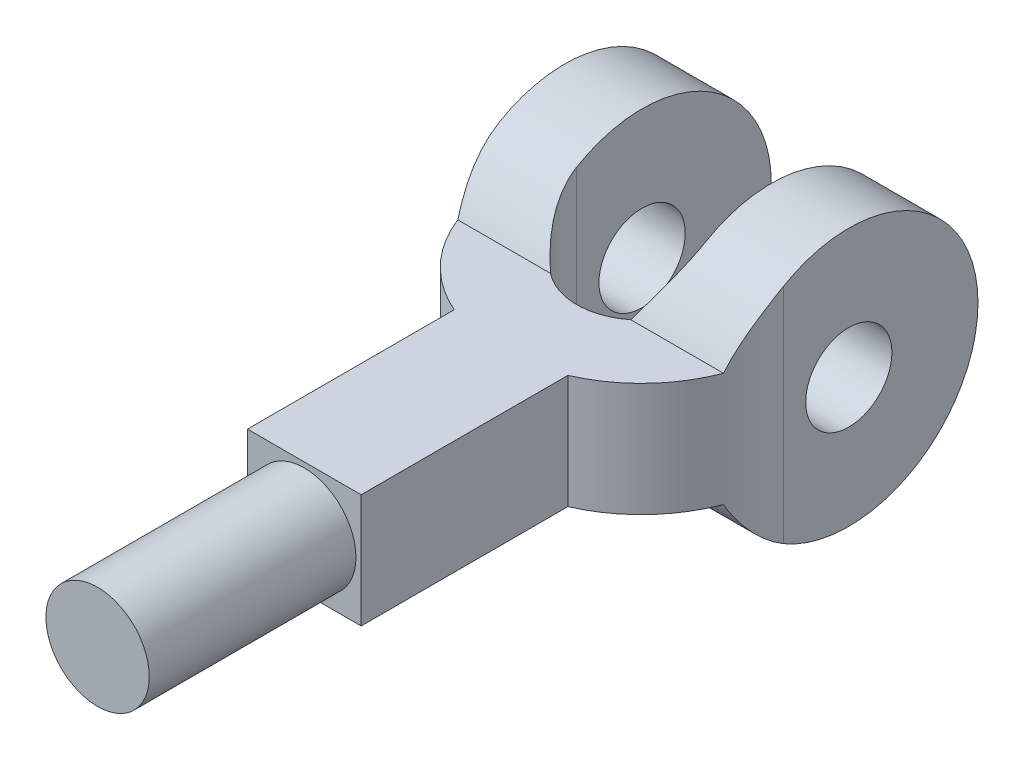
ISO-10303-21;
HEADER;
FILE_DESCRIPTION(('STEP AP214'),'2;1');
FILE_NAME('part.step','',(''),(''),'','','');
FILE_SCHEMA(('AUTOMOTIVE_DESIGN { 1 0 10303 214 1 1 1 1 }'));
ENDSEC;
DATA;
#1=APPLICATION_CONTEXT('core data for automotive mechanical design processes');
#2=APPLICATION_PROTOCOL_DEFINITION('international standard','automotive_design',2000,#1);
#3=PRODUCT_CONTEXT('',#1,'mechanical');
#4=PRODUCT('Part','Part','',(#3));
#5=PRODUCT_RELATED_PRODUCT_CATEGORY('part','',(#4));
#6=PRODUCT_DEFINITION_FORMATION('','',#4);
#7=PRODUCT_DEFINITION_CONTEXT('part definition',#1,'design');
#8=PRODUCT_DEFINITION('design','',#6,#7);
#9=PRODUCT_DEFINITION_SHAPE('','',#8);
#10=(LENGTH_UNIT() NAMED_UNIT(*) SI_UNIT(.MILLI.,.METRE.));
#11=(NAMED_UNIT(*) PLANE_ANGLE_UNIT() SI_UNIT($,.RADIAN.));
#12=(NAMED_UNIT(*) SI_UNIT($,.STERADIAN.) SOLID_ANGLE_UNIT());
#13=UNCERTAINTY_MEASURE_WITH_UNIT(LENGTH_MEASURE(1.E-05),#10,'distance_accuracy_value','');
#14=(GEOMETRIC_REPRESENTATION_CONTEXT(3) GLOBAL_UNCERTAINTY_ASSIGNED_CONTEXT((#13)) GLOBAL_UNIT_ASSIGNED_CONTEXT((#10,
#11,#12)) REPRESENTATION_CONTEXT('',''));
#15=CARTESIAN_POINT('',(0.,0.,0.));
#16=DIRECTION('',(0.,0.,1.));
#17=DIRECTION('',(1.,0.,0.));
#18=AXIS2_PLACEMENT_3D('',#15,#16,#17);
#19=CARTESIAN_POINT('',(-27.5,50.,0.));
#20=DIRECTION('',(1.,0.,0.));
#21=DIRECTION('',(0.,0.,-1.));
#22=AXIS2_PLACEMENT_3D('',#19,#20,#21);
#23=PLANE('',#22);
#24=CARTESIAN_POINT('',(-27.5,25.,-12.66));
#25=DIRECTION('',(1.,0.,0.));
#26=DIRECTION('',(0.,0.,-1.));
#27=AXIS2_PLACEMENT_3D('',#24,#25,#26);
#28=CIRCLE('',#27,8.345);
#29=CARTESIAN_POINT('',(-27.5,25.,-21.005));
#30=VERTEX_POINT('',#29);
#31=EDGE_CURVE('E228',#30,#30,#28,.T.);
#32=ORIENTED_EDGE('',*,*,#31,.T.);
#33=EDGE_LOOP('',(#32));
#34=FACE_BOUND('',#33,.T.);
#35=CARTESIAN_POINT('',(-27.5,25.,-12.66));
#36=DIRECTION('',(1.,0.,0.));
#37=DIRECTION('',(0.,0.,-1.));
#38=AXIS2_PLACEMENT_3D('',#35,#36,#37);
#39=CIRCLE('',#38,25.);
#40=CARTESIAN_POINT('',(-27.5,3.44253261628352,0.));
#41=VERTEX_POINT('',#40);
#42=CARTESIAN_POINT('',(-27.5,46.5574673837165,0.));
#43=VERTEX_POINT('',#42);
#44=EDGE_CURVE('E149',#41,#43,#39,.T.);
#45=ORIENTED_EDGE('',*,*,#44,.F.);
#46=DIRECTION('',(0.,-1.,0.));
#47=VECTOR('',#46,1.);
#48=CARTESIAN_POINT('',(-27.5,50.,0.));
#49=LINE('',#48,#47);
#50=EDGE_CURVE('E301',#43,#41,#49,.T.);
#51=ORIENTED_EDGE('',*,*,#50,.F.);
#52=EDGE_LOOP('',(#45,#51));
#53=FACE_BOUND('',#52,.T.);
#54=ADVANCED_FACE('F45',(#34,#53),#23,.F.);
#55=CARTESIAN_POINT('',(27.5,50.,0.));
#56=DIRECTION('',(-1.,0.,0.));
#57=DIRECTION('',(0.,0.,1.));
#58=AXIS2_PLACEMENT_3D('',#55,#56,#57);
#59=PLANE('',#58);
#60=CARTESIAN_POINT('',(27.5,25.,-12.66));
#61=DIRECTION('',(1.,0.,0.));
#62=DIRECTION('',(0.,0.,-1.));
#63=AXIS2_PLACEMENT_3D('',#60,#61,#62);
#64=CIRCLE('',#63,8.345);
#65=CARTESIAN_POINT('',(27.5,25.,-21.005));
#66=VERTEX_POINT('',#65);
#67=EDGE_CURVE('E148',#66,#66,#64,.T.);
#68=ORIENTED_EDGE('',*,*,#67,.F.);
#69=EDGE_LOOP('',(#68));
#70=FACE_BOUND('',#69,.T.);
#71=CARTESIAN_POINT('',(27.5,25.,-12.66));
#72=DIRECTION('',(1.,0.,0.));
#73=DIRECTION('',(0.,0.,-1.));
#74=AXIS2_PLACEMENT_3D('',#71,#72,#73);
#75=CIRCLE('',#74,25.);
#76=CARTESIAN_POINT('',(27.5,3.44253261628352,0.));
#77=VERTEX_POINT('',#76);
#78=CARTESIAN_POINT('',(27.5,46.5574673837165,0.));
#79=VERTEX_POINT('',#78);
#80=EDGE_CURVE('E136',#77,#79,#75,.T.);
#81=ORIENTED_EDGE('',*,*,#80,.T.);
#82=DIRECTION('',(0.,-1.,0.));
#83=VECTOR('',#82,1.);
#84=CARTESIAN_POINT('',(27.5,50.,0.));
#85=LINE('',#84,#83);
#86=EDGE_CURVE('E153',#79,#77,#85,.T.);
#87=ORIENTED_EDGE('',*,*,#86,.T.);
#88=EDGE_LOOP('',(#81,#87));
#89=FACE_BOUND('',#88,.T.);
#90=ADVANCED_FACE('F158',(#70,#89),#59,.F.);
#91=CARTESIAN_POINT('',(0.,50.,0.));
#92=DIRECTION('',(0.,-1.,0.));
#93=DIRECTION('',(0.,0.,-1.));
#94=AXIS2_PLACEMENT_3D('',#91,#92,#93);
#95=CYLINDRICAL_SURFACE('',#94,27.5);
#96=CARTESIAN_POINT('',(27.5,3.44253261628353,0.));
#97=CARTESIAN_POINT('',(27.5000064100216,3.6170203767677,0.297137278036953));
#98=CARTESIAN_POINT('',(27.4951844331749,3.79765493681244,0.590635094460552));
#99=CARTESIAN_POINT('',(27.4766382856092,4.17073114445457,1.1696793687987));
#100=CARTESIAN_POINT('',(27.4629154844147,4.36317097151182,1.45522704291315));
#101=CARTESIAN_POINT('',(27.4273395567106,4.75922755687698,2.01750985360668));
#102=CARTESIAN_POINT('',(27.4054945529184,4.96283297604414,2.29425349562406));
#103=CARTESIAN_POINT('',(27.3544629075488,5.38091242152332,2.83868512956266));
#104=CARTESIAN_POINT('',(27.3252760356392,5.59538678865208,3.10637283707822));
#105=CARTESIAN_POINT('',(27.2294767809172,6.24374184018554,3.88235477105203));
#106=CARTESIAN_POINT('',(27.1536686324291,6.69231482301268,4.37737976716038));
#107=CARTESIAN_POINT('',(26.9831882286162,7.62575812850552,5.32832625227106));
#108=CARTESIAN_POINT('',(26.8885138644172,8.11063250517134,5.78424336161912));
#109=CARTESIAN_POINT('',(26.7058550464797,9.01695533612832,6.57095866508621));
#110=CARTESIAN_POINT('',(26.6200919465108,9.43264199057492,6.90894617330038));
#111=CARTESIAN_POINT('',(26.4434189636212,10.2840638329334,7.55700730068837));
#112=CARTESIAN_POINT('',(26.3525100858322,10.7197951024102,7.86708634082237));
#113=CARTESIAN_POINT('',(26.1668174059729,11.6189220027506,8.46448680342255));
#114=CARTESIAN_POINT('',(26.0719924236214,12.0826987212366,8.75122177525073));
#115=CARTESIAN_POINT('',(25.8834991143702,13.0282462139983,9.29391327576847));
#116=CARTESIAN_POINT('',(25.7898309685632,13.5100197591802,9.54986503906685));
#117=CARTESIAN_POINT('',(25.6983849725756,14.,9.78994432064365));
#118=B_SPLINE_CURVE_WITH_KNOTS('',3,(#96,#97,#98,#99,#100,#101,#102,#103,#104,#105,#106,#107,
#108,#109,#110,#111,#112,#113,#114,#115,#116,#117),.UNSPECIFIED.,.F.,.F.,(4,2,2,2,2,2,2,2,2,2,
4),(0.,1.03359858006158,2.06703816327485,3.0994470091262,4.13188824819448,6.1461388101509,
8.16061465237124,9.78724401915538,11.4135567433544,13.0727312212714,14.7321622178071),.UNSPECIFIED.);
#119=CARTESIAN_POINT('',(25.6983849725756,14.,9.78994432064364));
#120=VERTEX_POINT('',#119);
#121=EDGE_CURVE('E140',#77,#120,#118,.T.);
#122=ORIENTED_EDGE('',*,*,#121,.F.);
#123=ORIENTED_EDGE('',*,*,#86,.F.);
#124=CARTESIAN_POINT('',(25.6983849725756,36.,9.78994432064365));
#125=CARTESIAN_POINT('',(25.8140691404019,36.6199234558296,9.48619944910974));
#126=CARTESIAN_POINT('',(25.9333310876651,37.2267178396408,9.15703712413836));
#127=CARTESIAN_POINT('',(26.1723920961389,38.411222190551,8.44959832570043));
#128=CARTESIAN_POINT('',(26.2921913661819,38.9889195442673,8.07130080244504));
#129=CARTESIAN_POINT('',(26.5226342564519,40.0976080669089,7.27778102628776));
#130=CARTESIAN_POINT('',(26.6334331178442,40.6294127376688,6.86374030998817));
#131=CARTESIAN_POINT('',(26.8428136137845,41.6591388265931,5.99281582066546));
#132=CARTESIAN_POINT('',(26.9413987051833,42.1570698139185,5.53594423462477));
#133=CARTESIAN_POINT('',(27.1002470638979,43.0098101857171,4.68716911167127));
#134=CARTESIAN_POINT('',(27.1641633500701,43.3719137779392,4.30325054648064));
#135=CARTESIAN_POINT('',(27.277729577524,44.071991485273,3.51213776674862));
#136=CARTESIAN_POINT('',(27.3273830081027,44.4099714868029,3.10494927429018));
#137=CARTESIAN_POINT('',(27.4102939400617,45.0667367729785,2.26038294178966));
#138=CARTESIAN_POINT('',(27.4432027360968,45.3850013237712,1.82256349147561));
#139=CARTESIAN_POINT('',(27.4768449897739,45.8409786257744,1.15039665370457));
#140=CARTESIAN_POINT('',(27.4854392297077,45.9894608429426,0.92366647909339));
#141=CARTESIAN_POINT('',(27.4970175371816,46.2790484670254,0.465379193007346));
#142=CARTESIAN_POINT('',(27.5000011609966,46.4201532896282,0.233821701220034));
#143=CARTESIAN_POINT('',(27.5,46.5574673837165,0.));
#144=B_SPLINE_CURVE_WITH_KNOTS('',3,(#124,#125,#126,#127,#128,#129,#130,#131,#132,#133,#134,
#135,#136,#137,#138,#139,#140,#141,#142,#143),.UNSPECIFIED.,.F.,.F.,(4,2,2,2,2,2,2,2,2,4),(0.,
2.09931096358299,4.19952426834013,6.24640764169904,8.2927103578225,9.88634952860904,
11.479598495235,13.104792637547,13.9180950013107,14.73146168377),.UNSPECIFIED.);
#145=CARTESIAN_POINT('',(25.6983849725756,36.,9.78994432064364));
#146=VERTEX_POINT('',#145);
#147=EDGE_CURVE('E143',#146,#79,#144,.T.);
#148=ORIENTED_EDGE('',*,*,#147,.F.);
#149=CARTESIAN_POINT('',(0.,36.,0.));
#150=DIRECTION('',(0.,1.,0.));
#151=DIRECTION('',(0.,0.,1.));
#152=AXIS2_PLACEMENT_3D('',#149,#150,#151);
#153=CIRCLE('',#152,27.5);
#154=CARTESIAN_POINT('',(11.,36.,25.2041663222571));
#155=VERTEX_POINT('',#154);
#156=EDGE_CURVE('E280',#155,#146,#153,.T.);
#157=ORIENTED_EDGE('',*,*,#156,.F.);
#158=DIRECTION('',(0.,-1.,0.));
#159=VECTOR('',#158,1.);
#160=CARTESIAN_POINT('',(11.,50.,25.2041663222571));
#161=LINE('',#160,#159);
#162=CARTESIAN_POINT('',(11.,14.,25.2041663222571));
#163=VERTEX_POINT('',#162);
#164=EDGE_CURVE('E160',#155,#163,#161,.T.);
#165=ORIENTED_EDGE('',*,*,#164,.T.);
#166=CARTESIAN_POINT('',(0.,14.,0.));
#167=DIRECTION('',(0.,-1.,0.));
#168=DIRECTION('',(0.,0.,-1.));
#169=AXIS2_PLACEMENT_3D('',#166,#167,#168);
#170=CIRCLE('',#169,27.5);
#171=EDGE_CURVE('E70',#120,#163,#170,.T.);
#172=ORIENTED_EDGE('',*,*,#171,.F.);
#173=EDGE_LOOP('',(#122,#123,#148,#157,#165,#172));
#174=FACE_BOUND('',#173,.T.);
#175=ADVANCED_FACE('F152',(#174),#95,.T.);
#176=CARTESIAN_POINT('',(11.,50.,25.2041663222571));
#177=DIRECTION('',(-1.,0.,0.));
#178=DIRECTION('',(0.,0.,1.));
#179=AXIS2_PLACEMENT_3D('',#176,#177,#178);
#180=PLANE('',#179);
#181=DIRECTION('',(0.,0.,1.));
#182=VECTOR('',#181,1.);
#183=CARTESIAN_POINT('',(11.,14.,25.2041663222571));
#184=LINE('',#183,#182);
#185=CARTESIAN_POINT('',(11.,14.,65.2041663222571));
#186=VERTEX_POINT('',#185);
#187=EDGE_CURVE('E275',#163,#186,#184,.T.);
#188=ORIENTED_EDGE('',*,*,#187,.F.);
#189=ORIENTED_EDGE('',*,*,#164,.F.);
#190=DIRECTION('',(0.,0.,-1.));
#191=VECTOR('',#190,1.);
#192=CARTESIAN_POINT('',(11.,36.,25.2041663222571));
#193=LINE('',#192,#191);
#194=CARTESIAN_POINT('',(11.,36.,65.2041663222571));
#195=VERTEX_POINT('',#194);
#196=EDGE_CURVE('E276',#195,#155,#193,.T.);
#197=ORIENTED_EDGE('',*,*,#196,.F.);
#198=DIRECTION('',(0.,-1.,0.));
#199=VECTOR('',#198,1.);
#200=CARTESIAN_POINT('',(11.,50.,65.2041663222571));
#201=LINE('',#200,#199);
#202=EDGE_CURVE('E165',#195,#186,#201,.T.);
#203=ORIENTED_EDGE('',*,*,#202,.T.);
#204=EDGE_LOOP('',(#188,#189,#197,#203));
#205=FACE_BOUND('',#204,.T.);
#206=ADVANCED_FACE('F267',(#205),#180,.F.);
#207=CARTESIAN_POINT('',(-11.,50.,65.2041663222571));
#208=DIRECTION('',(0.,0.,-1.));
#209=DIRECTION('',(-1.,0.,0.));
#210=AXIS2_PLACEMENT_3D('',#207,#208,#209);
#211=PLANE('',#210);
#212=CARTESIAN_POINT('',(0.,25.,65.2041663222571));
#213=DIRECTION('',(0.,0.,1.));
#214=DIRECTION('',(1.,0.,0.));
#215=AXIS2_PLACEMENT_3D('',#212,#213,#214);
#216=CIRCLE('',#215,10.);
#217=CARTESIAN_POINT('',(10.,25.,65.2041663222571));
#218=VERTEX_POINT('',#217);
#219=EDGE_CURVE('E12',#218,#218,#216,.T.);
#220=ORIENTED_EDGE('',*,*,#219,.F.);
#221=EDGE_LOOP('',(#220));
#222=FACE_BOUND('',#221,.T.);
#223=DIRECTION('',(1.,0.,0.));
#224=VECTOR('',#223,1.);
#225=CARTESIAN_POINT('',(-27.5,14.,65.2041663222571));
#226=LINE('',#225,#224);
#227=CARTESIAN_POINT('',(-11.,14.,65.2041663222571));
#228=VERTEX_POINT('',#227);
#229=EDGE_CURVE('E240',#228,#186,#226,.T.);
#230=ORIENTED_EDGE('',*,*,#229,.T.);
#231=ORIENTED_EDGE('',*,*,#202,.F.);
#232=DIRECTION('',(1.,0.,0.));
#233=VECTOR('',#232,1.);
#234=CARTESIAN_POINT('',(-27.5,36.,65.2041663222571));
#235=LINE('',#234,#233);
#236=CARTESIAN_POINT('',(-11.,36.,65.2041663222571));
#237=VERTEX_POINT('',#236);
#238=EDGE_CURVE('E244',#237,#195,#235,.T.);
#239=ORIENTED_EDGE('',*,*,#238,.F.);
#240=DIRECTION('',(0.,-1.,0.));
#241=VECTOR('',#240,1.);
#242=CARTESIAN_POINT('',(-11.,50.,65.2041663222571));
#243=LINE('',#242,#241);
#244=EDGE_CURVE('E175',#237,#228,#243,.T.);
#245=ORIENTED_EDGE('',*,*,#244,.T.);
#246=EDGE_LOOP('',(#230,#231,#239,#245));
#247=FACE_BOUND('',#246,.T.);
#248=ADVANCED_FACE('F263',(#222,#247),#211,.F.);
#249=CARTESIAN_POINT('',(-11.,50.,25.2041663222571));
#250=DIRECTION('',(1.,0.,0.));
#251=DIRECTION('',(0.,0.,-1.));
#252=AXIS2_PLACEMENT_3D('',#249,#250,#251);
#253=PLANE('',#252);
#254=DIRECTION('',(0.,0.,-1.));
#255=VECTOR('',#254,1.);
#256=CARTESIAN_POINT('',(-11.,14.,25.2041663222571));
#257=LINE('',#256,#255);
#258=CARTESIAN_POINT('',(-11.,14.,25.2041663222571));
#259=VERTEX_POINT('',#258);
#260=EDGE_CURVE('E63',#228,#259,#257,.T.);
#261=ORIENTED_EDGE('',*,*,#260,.F.);
#262=ORIENTED_EDGE('',*,*,#244,.F.);
#263=DIRECTION('',(0.,0.,1.));
#264=VECTOR('',#263,1.);
#265=CARTESIAN_POINT('',(-11.,36.,25.2041663222571));
#266=LINE('',#265,#264);
#267=CARTESIAN_POINT('',(-11.,36.,25.2041663222571));
#268=VERTEX_POINT('',#267);
#269=EDGE_CURVE('E279',#268,#237,#266,.T.);
#270=ORIENTED_EDGE('',*,*,#269,.F.);
#271=DIRECTION('',(0.,-1.,0.));
#272=VECTOR('',#271,1.);
#273=CARTESIAN_POINT('',(-11.,50.,25.2041663222571));
#274=LINE('',#273,#272);
#275=EDGE_CURVE('E179',#268,#259,#274,.T.);
#276=ORIENTED_EDGE('',*,*,#275,.T.);
#277=EDGE_LOOP('',(#261,#262,#270,#276));
#278=FACE_BOUND('',#277,.T.);
#279=ADVANCED_FACE('F266',(#278),#253,.F.);
#280=CARTESIAN_POINT('',(0.,50.,0.));
#281=DIRECTION('',(0.,-1.,0.));
#282=DIRECTION('',(0.,0.,-1.));
#283=AXIS2_PLACEMENT_3D('',#280,#281,#282);
#284=CYLINDRICAL_SURFACE('',#283,27.5);
#285=CARTESIAN_POINT('',(-25.6983849725756,14.,9.78994432064364));
#286=CARTESIAN_POINT('',(-25.8140691404019,13.3800765441704,9.48619944910974));
#287=CARTESIAN_POINT('',(-25.9333310876651,12.7732821603592,9.15703712413836));
#288=CARTESIAN_POINT('',(-26.1723920961389,11.588777809449,8.44959832570043));
#289=CARTESIAN_POINT('',(-26.2921913661819,11.0110804557327,8.07130080244503));
#290=CARTESIAN_POINT('',(-26.5226342564518,9.90239193309109,7.27778102628776));
#291=CARTESIAN_POINT('',(-26.6334331178442,9.37058726233118,6.86374030998817));
#292=CARTESIAN_POINT('',(-26.8428136137845,8.34086117340695,5.99281582066546));
#293=CARTESIAN_POINT('',(-26.9413987051833,7.84293018608148,5.53594423462477));
#294=CARTESIAN_POINT('',(-27.1002470638979,6.99018981428286,4.68716911167127));
#295=CARTESIAN_POINT('',(-27.1641633500701,6.62808622206083,4.30325054648064));
#296=CARTESIAN_POINT('',(-27.277729577524,5.92800851472697,3.51213776674862));
#297=CARTESIAN_POINT('',(-27.3273830081027,5.59002851319714,3.10494927429017));
#298=CARTESIAN_POINT('',(-27.4102939400617,4.93326322702154,2.26038294178966));
#299=CARTESIAN_POINT('',(-27.4432027360968,4.61499867622882,1.82256349147561));
#300=CARTESIAN_POINT('',(-27.4768449897739,4.15902137422562,1.15039665370457));
#301=CARTESIAN_POINT('',(-27.4854392297077,4.0105391570574,0.92366647909339));
#302=CARTESIAN_POINT('',(-27.4970175371816,3.72095153297464,0.465379193007346));
#303=CARTESIAN_POINT('',(-27.5000011609966,3.57984671037178,0.233821701220034));
#304=CARTESIAN_POINT('',(-27.5,3.44253261628353,0.));
#305=B_SPLINE_CURVE_WITH_KNOTS('',3,(#285,#286,#287,#288,#289,#290,#291,#292,#293,#294,#295,
#296,#297,#298,#299,#300,#301,#302,#303,#304),.UNSPECIFIED.,.F.,.F.,(4,2,2,2,2,2,2,2,2,4),(0.,
2.09931096358299,4.19952426834013,6.24640764169904,8.29271035782249,9.88634952860903,
11.479598495235,13.104792637547,13.9180950013107,14.73146168377),.UNSPECIFIED.);
#306=CARTESIAN_POINT('',(-25.6983849725756,14.,9.78994432064364));
#307=VERTEX_POINT('',#306);
#308=EDGE_CURVE('E156',#307,#41,#305,.T.);
#309=ORIENTED_EDGE('',*,*,#308,.F.);
#310=CARTESIAN_POINT('',(0.,14.,0.));
#311=DIRECTION('',(0.,-1.,0.));
#312=DIRECTION('',(0.,0.,-1.));
#313=AXIS2_PLACEMENT_3D('',#310,#311,#312);
#314=CIRCLE('',#313,27.5);
#315=EDGE_CURVE('E298',#259,#307,#314,.T.);
#316=ORIENTED_EDGE('',*,*,#315,.F.);
#317=ORIENTED_EDGE('',*,*,#275,.F.);
#318=CARTESIAN_POINT('',(0.,36.,0.));
#319=DIRECTION('',(0.,1.,0.));
#320=DIRECTION('',(0.,0.,1.));
#321=AXIS2_PLACEMENT_3D('',#318,#319,#320);
#322=CIRCLE('',#321,27.5);
#323=CARTESIAN_POINT('',(-25.6983849725756,36.,9.78994432064364));
#324=VERTEX_POINT('',#323);
#325=EDGE_CURVE('E284',#324,#268,#322,.T.);
#326=ORIENTED_EDGE('',*,*,#325,.F.);
#327=CARTESIAN_POINT('',(-27.5,46.5574673837165,0.));
#328=CARTESIAN_POINT('',(-27.5000064100216,46.3829796232323,0.297137278036951));
#329=CARTESIAN_POINT('',(-27.4951844331749,46.2023450631876,0.59063509446055));
#330=CARTESIAN_POINT('',(-27.4766382856092,45.8292688555454,1.1696793687987));
#331=CARTESIAN_POINT('',(-27.4629154844147,45.6368290284882,1.45522704291316));
#332=CARTESIAN_POINT('',(-27.4273395567106,45.240772443123,2.01750985360668));
#333=CARTESIAN_POINT('',(-27.4054945529184,45.0371670239559,2.29425349562406));
#334=CARTESIAN_POINT('',(-27.3544629075488,44.6190875784767,2.83868512956266));
#335=CARTESIAN_POINT('',(-27.3252760356392,44.4046132113479,3.10637283707822));
#336=CARTESIAN_POINT('',(-27.2294767809172,43.7562581598145,3.88235477105203));
#337=CARTESIAN_POINT('',(-27.1536686324291,43.3076851769873,4.37737976716038));
#338=CARTESIAN_POINT('',(-26.9831882286162,42.3742418714945,5.32832625227106));
#339=CARTESIAN_POINT('',(-26.8885138644172,41.8893674948287,5.78424336161912));
#340=CARTESIAN_POINT('',(-26.7058550464797,40.9830446638717,6.57095866508621));
#341=CARTESIAN_POINT('',(-26.6200919465108,40.5673580094251,6.90894617330038));
#342=CARTESIAN_POINT('',(-26.4434189636212,39.7159361670666,7.55700730068837));
#343=CARTESIAN_POINT('',(-26.3525100858322,39.2802048975898,7.86708634082238));
#344=CARTESIAN_POINT('',(-26.1668174059729,38.3810779972494,8.46448680342256));
#345=CARTESIAN_POINT('',(-26.0719924236214,37.9173012787634,8.75122177525073));
#346=CARTESIAN_POINT('',(-25.8834991143702,36.9717537860017,9.29391327576847));
#347=CARTESIAN_POINT('',(-25.7898309685632,36.4899802408197,9.54986503906685));
#348=CARTESIAN_POINT('',(-25.6983849725756,36.,9.78994432064365));
#349=B_SPLINE_CURVE_WITH_KNOTS('',3,(#327,#328,#329,#330,#331,#332,#333,#334,#335,#336,#337,
#338,#339,#340,#341,#342,#343,#344,#345,#346,#347,#348),.UNSPECIFIED.,.F.,.F.,(4,2,2,2,2,2,2,2,
2,2,4),(0.,1.03359858006158,2.06703816327485,3.0994470091262,4.13188824819448,6.1461388101509,
8.16061465237124,9.78724401915538,11.4135567433544,13.0727312212715,14.7321622178071),.UNSPECIFIED.);
#350=EDGE_CURVE('E313',#43,#324,#349,.T.);
#351=ORIENTED_EDGE('',*,*,#350,.F.);
#352=ORIENTED_EDGE('',*,*,#50,.T.);
#353=EDGE_LOOP('',(#309,#316,#317,#326,#351,#352));
#354=FACE_BOUND('',#353,.T.);
#355=ADVANCED_FACE('F47',(#354),#284,.T.);
#356=CARTESIAN_POINT('',(-27.5,25.,-12.66));
#357=DIRECTION('',(1.,0.,0.));
#358=DIRECTION('',(0.,0.,-1.));
#359=AXIS2_PLACEMENT_3D('',#356,#357,#358);
#360=CYLINDRICAL_SURFACE('',#359,8.345);
#361=ORIENTED_EDGE('',*,*,#31,.F.);
#362=EDGE_LOOP('',(#361));
#363=FACE_BOUND('',#362,.T.);
#364=CARTESIAN_POINT('',(-12.5,25.,-12.66));
#365=DIRECTION('',(-1.,0.,0.));
#366=DIRECTION('',(0.,0.,1.));
#367=AXIS2_PLACEMENT_3D('',#364,#365,#366);
#368=CIRCLE('',#367,8.345);
#369=CARTESIAN_POINT('',(-12.5,25.,-4.315));
#370=VERTEX_POINT('',#369);
#371=EDGE_CURVE('E385',#370,#370,#368,.T.);
#372=ORIENTED_EDGE('',*,*,#371,.F.);
#373=EDGE_LOOP('',(#372));
#374=FACE_BOUND('',#373,.T.);
#375=ADVANCED_FACE('F328',(#363,#374),#360,.F.);
#376=CARTESIAN_POINT('',(-27.5,14.,9.78994432064364));
#377=DIRECTION('',(0.,-1.,0.));
#378=DIRECTION('',(0.,0.,-1.));
#379=AXIS2_PLACEMENT_3D('',#376,#377,#378);
#380=PLANE('',#379);
#381=ORIENTED_EDGE('',*,*,#315,.T.);
#382=DIRECTION('',(1.,0.,0.));
#383=VECTOR('',#382,1.);
#384=CARTESIAN_POINT('',(-27.5,14.,9.78994432064364));
#385=LINE('',#384,#383);
#386=CARTESIAN_POINT('',(-7.77219339689237,14.,9.78994432064364));
#387=VERTEX_POINT('',#386);
#388=EDGE_CURVE('E195',#307,#387,#385,.T.);
#389=ORIENTED_EDGE('',*,*,#388,.T.);
#390=CARTESIAN_POINT('',(0.,14.,0.));
#391=DIRECTION('',(0.,-1.,0.));
#392=DIRECTION('',(0.,0.,-1.));
#393=AXIS2_PLACEMENT_3D('',#390,#391,#392);
#394=CIRCLE('',#393,12.5);
#395=CARTESIAN_POINT('',(7.77219339689237,14.,9.78994432064364));
#396=VERTEX_POINT('',#395);
#397=EDGE_CURVE('E50',#387,#396,#394,.F.);
#398=ORIENTED_EDGE('',*,*,#397,.T.);
#399=EDGE_CURVE('E193',#396,#120,#385,.T.);
#400=ORIENTED_EDGE('',*,*,#399,.T.);
#401=ORIENTED_EDGE('',*,*,#171,.T.);
#402=ORIENTED_EDGE('',*,*,#187,.T.);
#403=ORIENTED_EDGE('',*,*,#229,.F.);
#404=ORIENTED_EDGE('',*,*,#260,.T.);
#405=EDGE_LOOP('',(#381,#389,#398,#400,#401,#402,#403,#404));
#406=FACE_BOUND('',#405,.T.);
#407=ADVANCED_FACE('F192',(#406),#380,.T.);
#408=CARTESIAN_POINT('',(-27.5,36.,9.78994432064364));
#409=DIRECTION('',(0.,1.,0.));
#410=DIRECTION('',(0.,0.,1.));
#411=AXIS2_PLACEMENT_3D('',#408,#409,#410);
#412=PLANE('',#411);
#413=ORIENTED_EDGE('',*,*,#325,.T.);
#414=ORIENTED_EDGE('',*,*,#269,.T.);
#415=ORIENTED_EDGE('',*,*,#238,.T.);
#416=ORIENTED_EDGE('',*,*,#196,.T.);
#417=ORIENTED_EDGE('',*,*,#156,.T.);
#418=DIRECTION('',(1.,0.,0.));
#419=VECTOR('',#418,1.);
#420=CARTESIAN_POINT('',(-27.5,36.,9.78994432064364));
#421=LINE('',#420,#419);
#422=CARTESIAN_POINT('',(7.77219339689237,36.,9.78994432064364));
#423=VERTEX_POINT('',#422);
#424=EDGE_CURVE('E247',#423,#146,#421,.T.);
#425=ORIENTED_EDGE('',*,*,#424,.F.);
#426=CARTESIAN_POINT('',(0.,36.,0.));
#427=DIRECTION('',(0.,1.,0.));
#428=DIRECTION('',(0.,0.,1.));
#429=AXIS2_PLACEMENT_3D('',#426,#427,#428);
#430=CIRCLE('',#429,12.5);
#431=CARTESIAN_POINT('',(-7.77219339689237,36.,9.78994432064364));
#432=VERTEX_POINT('',#431);
#433=EDGE_CURVE('E182',#423,#432,#430,.F.);
#434=ORIENTED_EDGE('',*,*,#433,.T.);
#435=EDGE_CURVE('E238',#324,#432,#421,.T.);
#436=ORIENTED_EDGE('',*,*,#435,.F.);
#437=EDGE_LOOP('',(#413,#414,#415,#416,#417,#425,#434,#436));
#438=FACE_BOUND('',#437,.T.);
#439=ADVANCED_FACE('F317',(#438),#412,.T.);
#440=CARTESIAN_POINT('',(-27.5,25.,-12.66));
#441=DIRECTION('',(1.,0.,0.));
#442=DIRECTION('',(0.,0.,-1.));
#443=AXIS2_PLACEMENT_3D('',#440,#441,#442);
#444=CYLINDRICAL_SURFACE('',#443,25.);
#445=ORIENTED_EDGE('',*,*,#350,.T.);
#446=ORIENTED_EDGE('',*,*,#435,.T.);
#447=CARTESIAN_POINT('',(-7.77219339689236,36.,9.78994432064365));
#448=CARTESIAN_POINT('',(-7.95125493530936,36.2901245964074,9.64777995607245));
#449=CARTESIAN_POINT('',(-8.12800668946448,36.5786238437377,9.49945589016651));
#450=CARTESIAN_POINT('',(-8.47612487202498,37.1521827718378,9.19018870541052));
#451=CARTESIAN_POINT('',(-8.64749014787699,37.437241708548,9.02924291127213));
#452=CARTESIAN_POINT('',(-9.1532241324392,38.2884399553427,8.52614290537653));
#453=CARTESIAN_POINT('',(-9.47817836811775,38.8489075391986,8.16455093610505));
#454=CARTESIAN_POINT('',(-10.0991322030903,39.9579750790307,7.38308409473828));
#455=CARTESIAN_POINT('',(-10.3947038160651,40.5063283960239,6.96251702677902));
#456=CARTESIAN_POINT('',(-10.9421723343344,41.5780074053616,6.06582581804181));
#457=CARTESIAN_POINT('',(-11.1941321799227,42.1013683625994,5.58978342878708));
#458=CARTESIAN_POINT('',(-11.5510387695185,42.9089134335481,4.78847679236379));
#459=CARTESIAN_POINT('',(-11.6739317626676,43.203263868376,4.48131431479051));
#460=CARTESIAN_POINT('',(-11.8977662852443,43.7796165789634,3.84785437948333));
#461=CARTESIAN_POINT('',(-11.9987075649322,44.0616187142099,3.52155670410611));
#462=CARTESIAN_POINT('',(-12.1751777945896,44.6102480191721,2.85208187938311));
#463=CARTESIAN_POINT('',(-12.2508128907587,44.8769354214119,2.50898233518133));
#464=CARTESIAN_POINT('',(-12.3739897966923,45.3942414194251,1.80600232646627));
#465=CARTESIAN_POINT('',(-12.4215363635321,45.6448627297396,1.44612471463281));
#466=CARTESIAN_POINT('',(-12.4800744148841,46.0893119604496,0.770461570243058));
#467=CARTESIAN_POINT('',(-12.4956970762415,46.2858114047631,0.456832692726226));
#468=CARTESIAN_POINT('',(-12.5027598606034,46.6647958990798,-0.179072395358173));
#469=CARTESIAN_POINT('',(-12.4942020889823,46.8472821677798,-0.501347850653866));
#470=CARTESIAN_POINT('',(-12.4510349714951,47.197153535467,-1.15248043547064));
#471=CARTESIAN_POINT('',(-12.4164163302729,47.3645332223978,-1.48133987260873));
#472=CARTESIAN_POINT('',(-12.3194956100155,47.6831223623089,-2.14283734231292));
#473=CARTESIAN_POINT('',(-12.2571933441718,47.8343317061636,-2.47547540036231));
#474=CARTESIAN_POINT('',(-12.1031898818013,48.120707162952,-3.14339754453979));
#475=CARTESIAN_POINT('',(-12.0113120994641,48.2557700538399,-3.47868541507488));
#476=CARTESIAN_POINT('',(-11.7975025879107,48.5083863162146,-4.14629610517807));
#477=CARTESIAN_POINT('',(-11.675570459707,48.6259394552165,-4.47861888532231));
#478=CARTESIAN_POINT('',(-11.4015256289367,48.8435456183411,-5.13635049223174));
#479=CARTESIAN_POINT('',(-11.2494231284989,48.9436045366841,-5.4617616151101));
#480=CARTESIAN_POINT('',(-10.9154597904565,49.1267895922462,-6.10188682282948));
#481=CARTESIAN_POINT('',(-10.7336016705094,49.2099172742839,-6.41660188140237));
#482=CARTESIAN_POINT('',(-10.3622763257927,49.3521562253686,-6.99851854272957));
#483=CARTESIAN_POINT('',(-10.1757258479853,49.4128882419295,-7.26719213596747));
#484=CARTESIAN_POINT('',(-9.78084745450852,49.5226385241789,-7.79053617959688));
#485=CARTESIAN_POINT('',(-9.57252132073323,49.5716577472441,-8.04520777316853));
#486=CARTESIAN_POINT('',(-9.1354345708889,49.6591610810036,-8.5382896371195));
#487=CARTESIAN_POINT('',(-8.90667403707088,49.6976452341003,-8.77669997294559));
#488=CARTESIAN_POINT('',(-8.43026263450028,49.7653967310706,-9.23525791192028));
#489=CARTESIAN_POINT('',(-8.1826112517426,49.794663824044,-9.45540501780032));
#490=CARTESIAN_POINT('',(-7.6707337024581,49.8453088682533,-9.87517837614762));
#491=CARTESIAN_POINT('',(-7.40654821205247,49.8667053536096,-10.0748520296214));
#492=CARTESIAN_POINT('',(-6.86287230355462,49.9030967378969,-10.4527790599293));
#493=CARTESIAN_POINT('',(-6.58338205179693,49.918091706385,-10.6310326694925));
#494=CARTESIAN_POINT('',(-6.01092519448945,49.9430271165508,-10.9648795591732));
#495=CARTESIAN_POINT('',(-5.71795694699316,49.9529669406018,-11.1204700687056));
#496=CARTESIAN_POINT('',(-5.12049411895543,49.9690409001247,-11.407911552963));
#497=CARTESIAN_POINT('',(-4.81599919172051,49.9751749210309,-11.5397618129535));
#498=CARTESIAN_POINT('',(-4.18477125172921,49.9849498791525,-11.7837524042981));
#499=CARTESIAN_POINT('',(-3.85763827540777,49.9884783524719,-11.8948636384536));
#500=CARTESIAN_POINT('',(-3.19528304436041,49.9936828965981,-12.089637625019));
#501=CARTESIAN_POINT('',(-2.86006059300071,49.9953589223304,-12.1732997094898));
#502=CARTESIAN_POINT('',(-2.18381300930325,49.9976833792043,-12.3126011129079));
#503=CARTESIAN_POINT('',(-1.8427874514936,49.9983317346682,-12.368238367901));
#504=CARTESIAN_POINT('',(-1.15730172764831,49.9991615632358,-12.4510981445285));
#505=CARTESIAN_POINT('',(-0.812841548578814,49.999343034567,-12.4783205582915));
#506=CARTESIAN_POINT('',(-0.117048592551513,49.9995192477441,-12.5043802127893));
#507=CARTESIAN_POINT('',(0.234302430120665,49.9995108015831,-12.5027329399446));
#508=CARTESIAN_POINT('',(0.935622976444318,49.9992823891482,-12.4698775472103));
#509=CARTESIAN_POINT('',(1.2855924803338,49.9990624198594,-12.4386690059881));
#510=CARTESIAN_POINT('',(1.98168972507581,49.9980814277038,-12.346908796249));
#511=CARTESIAN_POINT('',(2.32781717832854,49.9973203646067,-12.2863549460163));
#512=CARTESIAN_POINT('',(3.01374371723942,49.9946273127458,-12.1363338330461));
#513=CARTESIAN_POINT('',(3.35354281464168,49.9926953261551,-12.0468666239715));
#514=CARTESIAN_POINT('',(4.02471048101889,49.9867491231399,-11.8395600324694));
#515=CARTESIAN_POINT('',(4.35607073788998,49.9827329311577,-11.7216937883047));
#516=CARTESIAN_POINT('',(5.00764314657957,49.9714578961648,-11.4584887452686));
#517=CARTESIAN_POINT('',(5.32785524796061,49.9641990384854,-11.313149822122));
#518=CARTESIAN_POINT('',(5.95480077246909,49.9450711881034,-10.9960786074901));
#519=CARTESIAN_POINT('',(6.26153406143898,49.9332021495261,-10.8243460533797));
#520=CARTESIAN_POINT('',(6.85924353785896,49.9033275253775,-10.4558136074393));
#521=CARTESIAN_POINT('',(7.1502199258004,49.8853220179081,-10.2590140346699));
#522=CARTESIAN_POINT('',(7.71139025068222,49.8417673894409,-9.84403437598554));
#523=CARTESIAN_POINT('',(7.98176341852745,49.8162957715652,-9.62608862874164));
#524=CARTESIAN_POINT('',(8.50288846313148,49.7561344954557,-9.16902383010334));
#525=CARTESIAN_POINT('',(8.75364045684763,49.7214448921736,-8.92990490493554));
#526=CARTESIAN_POINT('',(9.23354932915287,49.6412971385836,-8.43272748827872));
#527=CARTESIAN_POINT('',(9.46271426451288,49.5958430282653,-8.17467612727374));
#528=CARTESIAN_POINT('',(9.89787497151594,49.4927202028717,-7.6420107709033));
#529=CARTESIAN_POINT('',(10.1038716471067,49.4350519646038,-7.36739742237365));
#530=CARTESIAN_POINT('',(10.4837954491191,49.3087683007707,-6.8152729220263));
#531=CARTESIAN_POINT('',(10.6586562338171,49.2406639394106,-6.538286829965));
#532=CARTESIAN_POINT('',(10.9847695321018,49.0911826630333,-5.97419178603637));
#533=CARTESIAN_POINT('',(11.1360227901579,49.0098061667219,-5.68708315373619));
#534=CARTESIAN_POINT('',(11.4143409007668,48.833227154032,-5.10555773751999));
#535=CARTESIAN_POINT('',(11.5414096313598,48.7380268586525,-4.81114213386557));
#536=CARTESIAN_POINT('',(11.7712248944291,48.5335304058665,-4.21775987401757));
#537=CARTESIAN_POINT('',(11.8739713820671,48.4242342224745,-3.9187932094351));
#538=CARTESIAN_POINT('',(12.0538573610705,48.1935422399345,-3.32406801254909));
#539=CARTESIAN_POINT('',(12.1313967165444,48.0723796128859,-3.02833955340843));
#540=CARTESIAN_POINT('',(12.2637642015335,47.8167796152106,-2.43756602406794));
#541=CARTESIAN_POINT('',(12.3185927406922,47.6823424840753,-2.14252094163725));
#542=CARTESIAN_POINT('',(12.4064236243125,47.4006868834199,-1.55525754771891));
#543=CARTESIAN_POINT('',(12.4394221173885,47.2534661637239,-1.26303974399267));
#544=CARTESIAN_POINT('',(12.4846909813056,46.9469431493083,-0.683389357166898));
#545=CARTESIAN_POINT('',(12.496960256084,46.7876402162041,-0.395957027896088));
#546=CARTESIAN_POINT('',(12.5022630635316,46.4433328546751,0.197338121115261));
#547=CARTESIAN_POINT('',(12.4935232536734,46.2572988344719,0.502618493632299));
#548=CARTESIAN_POINT('',(12.4548025976939,45.8729792321145,1.10394218601792));
#549=CARTESIAN_POINT('',(12.424821041238,45.6746932404508,1.39998519663884));
#550=CARTESIAN_POINT('',(12.3454141934786,45.266926456987,1.98164849477422));
#551=CARTESIAN_POINT('',(12.295984000246,45.0574428543983,2.26726613477953));
#552=CARTESIAN_POINT('',(12.179456795494,44.6283852236451,2.82712272634654));
#553=CARTESIAN_POINT('',(12.1123558595279,44.408808962983,3.10135913460105));
#554=CARTESIAN_POINT('',(11.9188026161894,43.8310803947616,3.79279141106595));
#555=CARTESIAN_POINT('',(11.7804566690496,43.4661507230803,4.20105622472027));
#556=CARTESIAN_POINT('',(11.4701881694004,42.7173035810396,4.98630001942176));
#557=CARTESIAN_POINT('',(11.2982484654755,42.3333764865623,5.36326287845498));
#558=CARTESIAN_POINT('',(10.9256806817081,41.5485485861242,6.08649583263676));
#559=CARTESIAN_POINT('',(10.7249688644668,41.1476007284906,6.43267138610187));
#560=CARTESIAN_POINT('',(10.3000458040535,40.3325443756817,7.0931837877248));
#561=CARTESIAN_POINT('',(10.0758405207251,39.9184392367416,7.40752867111885));
#562=CARTESIAN_POINT('',(9.52550710352663,38.9311589798656,8.11036489403824));
#563=CARTESIAN_POINT('',(9.19128121332142,38.3532985122538,8.48600941978783));
#564=CARTESIAN_POINT('',(8.67109029674454,37.4766104907036,9.0067633849746));
#565=CARTESIAN_POINT('',(8.49524415585712,37.1838454893001,9.17268703268847));
#566=CARTESIAN_POINT('',(8.13781139553568,36.5946286888665,9.49122099945069));
#567=CARTESIAN_POINT('',(7.95622517321127,36.2981771457352,9.6438322367423));
#568=CARTESIAN_POINT('',(7.77219339689236,36.,9.78994432064365));
#569=B_SPLINE_CURVE_WITH_KNOTS('',3,(#447,#448,#449,#450,#451,#452,#453,#454,#455,#456,#457,
#458,#459,#460,#461,#462,#463,#464,#465,#466,#467,#468,#469,#470,#471,#472,#473,#474,#475,#476,
#477,#478,#479,#480,#481,#482,#483,#484,#485,#486,#487,#488,#489,#490,#491,#492,#493,#494,#495,
#496,#497,#498,#499,#500,#501,#502,#503,#504,#505,#506,#507,#508,#509,#510,#511,#512,#513,#514,
#515,#516,#517,#518,#519,#520,#521,#522,#523,#524,#525,#526,#527,#528,#529,#530,#531,#532,#533,
#534,#535,#536,#537,#538,#539,#540,#541,#542,#543,#544,#545,#546,#547,#548,#549,#550,#551,#552,
#553,#554,#555,#556,#557,#558,#559,#560,#561,#562,#563,#564,#565,#566,#567,#568),.UNSPECIFIED.,
.F.,.F.,(4,2,2,2,2,2,2,2,2,2,2,2,2,2,2,2,2,2,2,2,2,2,2,2,2,2,2,2,2,2,2,2,2,2,2,2,2,2,2,2,2,2,2,
2,2,2,2,2,2,2,2,2,2,2,2,2,2,2,2,2,4),(0.,1.1080317128115,2.2162989209574,4.43928841460697,
6.69097803946474,8.93939043949469,10.2669110577718,11.594446778169,12.9163422531975,
14.2380137876939,15.348245387243,16.4583803226386,17.568911407193,18.6794499856978,
19.7967461991015,20.914057246014,22.0309911156773,23.1478230297707,24.1446631890813,
25.1414218410854,26.1381764811929,27.1349582518894,28.1293774896969,29.1237859221452,
30.1183158201044,31.1128756548219,32.1481912550177,33.183532046401,34.2189490767395,
35.2543700378213,36.3071846369469,37.3600142419193,38.4129221329128,39.4658280697345,
40.5197338534079,41.5736444046336,42.6275654432841,43.6814730686552,44.7248060930755,
45.7681328979513,46.8110687542915,47.8539639046517,48.8564287236372,49.8588619232399,
50.8611342448768,51.8634084142069,52.8489047222685,53.8343832537956,54.8200356029282,
55.8057400670414,56.8775220994749,57.9493399745285,59.0214281690074,60.0937546616972,
61.7855383849253,63.4781881223083,65.1758680630403,66.8731183726762,69.1677751608703,
70.3066109052433,71.4453680345131),.UNSPECIFIED.);
#570=CARTESIAN_POINT('',(-12.5,46.5574673837165,0.));
#571=VERTEX_POINT('',#570);
#572=EDGE_CURVE('E209',#432,#571,#569,.T.);
#573=ORIENTED_EDGE('',*,*,#572,.T.);
#574=CARTESIAN_POINT('',(-12.5,25.,-12.66));
#575=DIRECTION('',(-1.,0.,0.));
#576=DIRECTION('',(0.,0.,1.));
#577=AXIS2_PLACEMENT_3D('',#574,#575,#576);
#578=CIRCLE('',#577,25.);
#579=CARTESIAN_POINT('',(-12.5,3.44253261628352,0.));
#580=VERTEX_POINT('',#579);
#581=EDGE_CURVE('E215',#571,#580,#578,.T.);
#582=ORIENTED_EDGE('',*,*,#581,.T.);
#583=CARTESIAN_POINT('',(7.77219339689237,14.,9.78994432064364));
#584=CARTESIAN_POINT('',(7.95125493530937,13.7098754035926,9.64777995607245));
#585=CARTESIAN_POINT('',(8.12800668946449,13.4213761562623,9.4994558901665));
#586=CARTESIAN_POINT('',(8.47612487202499,12.8478172281622,9.19018870541052));
#587=CARTESIAN_POINT('',(8.64749014787699,12.562758291452,9.02924291127212));
#588=CARTESIAN_POINT('',(9.1532241324392,11.7115600446573,8.52614290537653));
#589=CARTESIAN_POINT('',(9.47817836811776,11.1510924608014,8.16455093610504));
#590=CARTESIAN_POINT('',(10.0991322030903,10.0420249209693,7.38308409473827));
#591=CARTESIAN_POINT('',(10.3947038160651,9.49367160397609,6.96251702677901));
#592=CARTESIAN_POINT('',(10.9421723343344,8.42199259463843,6.06582581804181));
#593=CARTESIAN_POINT('',(11.1941321799227,7.89863163740065,5.58978342878709));
#594=CARTESIAN_POINT('',(11.5510387695185,7.09108656645195,4.7884767923638));
#595=CARTESIAN_POINT('',(11.6739317626676,6.79673613162404,4.48131431479051));
#596=CARTESIAN_POINT('',(11.8977662852443,6.22038342103659,3.84785437948333));
#597=CARTESIAN_POINT('',(11.9987075649322,5.93838128579009,3.52155670410612));
#598=CARTESIAN_POINT('',(12.1751777945896,5.38975198082789,2.85208187938312));
#599=CARTESIAN_POINT('',(12.2508128907587,5.1230645785881,2.50898233518134));
#600=CARTESIAN_POINT('',(12.3739897966923,4.6057585805749,1.80600232646628));
#601=CARTESIAN_POINT('',(12.4215363635321,4.35513727026036,1.44612471463282));
#602=CARTESIAN_POINT('',(12.4800744148841,3.91068803955037,0.770461570243059));
#603=CARTESIAN_POINT('',(12.4956970762415,3.71418859523686,0.456832692726228));
#604=CARTESIAN_POINT('',(12.5027598606034,3.3352041009202,-0.17907239535817));
#605=CARTESIAN_POINT('',(12.4942020889823,3.15271783222017,-0.501347850653864));
#606=CARTESIAN_POINT('',(12.4510349714951,2.802846464533,-1.15248043547064));
#607=CARTESIAN_POINT('',(12.4164163302729,2.63546677760222,-1.48133987260873));
#608=CARTESIAN_POINT('',(12.3194956100155,2.31687763769113,-2.14283734231293));
#609=CARTESIAN_POINT('',(12.2571933441718,2.16566829383644,-2.47547540036231));
#610=CARTESIAN_POINT('',(12.1031898818013,1.87929283704805,-3.14339754453979));
#611=CARTESIAN_POINT('',(12.0113120994641,1.74422994616006,-3.47868541507488));
#612=CARTESIAN_POINT('',(11.7975025879107,1.49161368378544,-4.14629610517807));
#613=CARTESIAN_POINT('',(11.675570459707,1.37406054478346,-4.4786188853223));
#614=CARTESIAN_POINT('',(11.4015256289367,1.15645438165892,-5.13635049223174));
#615=CARTESIAN_POINT('',(11.2494231284989,1.05639546331592,-5.4617616151101));
#616=CARTESIAN_POINT('',(10.9154597904565,0.873210407753783,-6.10188682282948));
#617=CARTESIAN_POINT('',(10.7336016705094,0.790082725716125,-6.41660188140237));
#618=CARTESIAN_POINT('',(10.3622763257927,0.647843774631393,-6.99851854272957));
#619=CARTESIAN_POINT('',(10.1757258479853,0.587111758070494,-7.26719213596747));
#620=CARTESIAN_POINT('',(9.78084745450852,0.47736147582107,-7.79053617959688));
#621=CARTESIAN_POINT('',(9.57252132073322,0.428342252755853,-8.04520777316853));
#622=CARTESIAN_POINT('',(9.1354345708889,0.340838918996387,-8.5382896371195));
#623=CARTESIAN_POINT('',(8.90667403707087,0.302354765899707,-8.77669997294559));
#624=CARTESIAN_POINT('',(8.43026263450028,0.234603268929424,-9.23525791192028));
#625=CARTESIAN_POINT('',(8.1826112517426,0.205336175955965,-9.45540501780032));
#626=CARTESIAN_POINT('',(7.6707337024581,0.15469113174665,-9.87517837614761));
#627=CARTESIAN_POINT('',(7.40654821205246,0.133294646390422,-10.0748520296214));
#628=CARTESIAN_POINT('',(6.86287230355461,0.0969032621031404,-10.4527790599293));
#629=CARTESIAN_POINT('',(6.58338205179693,0.0819082936149759,-10.6310326694925));
#630=CARTESIAN_POINT('',(6.01092519448945,0.0569728834491619,-10.9648795591732));
#631=CARTESIAN_POINT('',(5.71795694699316,0.0470330593981727,-11.1204700687056));
#632=CARTESIAN_POINT('',(5.12049411895543,0.0309590998753315,-11.407911552963));
#633=CARTESIAN_POINT('',(4.81599919172051,0.0248250789691016,-11.5397618129535));
#634=CARTESIAN_POINT('',(4.18477125172921,0.0150501208475209,-11.7837524042981));
#635=CARTESIAN_POINT('',(3.85763827540777,0.0115216475281526,-11.8948636384536));
#636=CARTESIAN_POINT('',(3.1952830443604,0.00631710340191368,-12.089637625019));
#637=CARTESIAN_POINT('',(2.86006059300071,0.00464107766959016,-12.1732997094898));
#638=CARTESIAN_POINT('',(2.18381300930325,0.00231662079572639,-12.3126011129079));
#639=CARTESIAN_POINT('',(1.8427874514936,0.0016682653318256,-12.368238367901));
#640=CARTESIAN_POINT('',(1.15730172764831,0.00083843676425319,-12.4510981445285));
#641=CARTESIAN_POINT('',(0.812841548578814,0.000656965433011746,-12.4783205582915));
#642=CARTESIAN_POINT('',(0.117048592551514,0.000480752255951333,-12.5043802127893));
#643=CARTESIAN_POINT('',(-0.234302430120663,0.000489198416882778,-12.5027329399446));
#644=CARTESIAN_POINT('',(-0.935622976444316,0.000717610851818008,-12.4698775472103));
#645=CARTESIAN_POINT('',(-1.2855924803338,0.000937580140632404,-12.4386690059881));
#646=CARTESIAN_POINT('',(-1.98168972507581,0.00191857229620828,-12.346908796249));
#647=CARTESIAN_POINT('',(-2.32781717832854,0.00267963539327017,-12.2863549460163));
#648=CARTESIAN_POINT('',(-3.01374371723942,0.00537268725424627,-12.1363338330461));
#649=CARTESIAN_POINT('',(-3.35354281464168,0.00730467384494796,-12.0468666239715));
#650=CARTESIAN_POINT('',(-4.02471048101889,0.0132508768600583,-11.8395600324694));
#651=CARTESIAN_POINT('',(-4.35607073788998,0.0172670688423246,-11.7216937883047));
#652=CARTESIAN_POINT('',(-5.00764314657957,0.0285421038352412,-11.4584887452686));
#653=CARTESIAN_POINT('',(-5.32785524796062,0.0358009615145854,-11.313149822122));
#654=CARTESIAN_POINT('',(-5.95480077246909,0.0549288118966305,-10.9960786074901));
#655=CARTESIAN_POINT('',(-6.26153406143898,0.0667978504738957,-10.8243460533797));
#656=CARTESIAN_POINT('',(-6.85924353785896,0.0966724746224964,-10.4558136074393));
#657=CARTESIAN_POINT('',(-7.1502199258004,0.114677982091922,-10.2590140346699));
#658=CARTESIAN_POINT('',(-7.71139025068222,0.158232610559094,-9.84403437598554));
#659=CARTESIAN_POINT('',(-7.98176341852745,0.183704228434791,-9.62608862874164));
#660=CARTESIAN_POINT('',(-8.50288846313148,0.243865504544312,-9.16902383010334));
#661=CARTESIAN_POINT('',(-8.75364045684763,0.278555107826402,-8.92990490493554));
#662=CARTESIAN_POINT('',(-9.23354932915287,0.358702861416416,-8.43272748827872));
#663=CARTESIAN_POINT('',(-9.46271426451288,0.404156971734688,-8.17467612727374));
#664=CARTESIAN_POINT('',(-9.89787497151594,0.507279797128354,-7.64201077090331));
#665=CARTESIAN_POINT('',(-10.1038716471067,0.564948035396216,-7.36739742237365));
#666=CARTESIAN_POINT('',(-10.4837954491191,0.691231699229353,-6.8152729220263));
#667=CARTESIAN_POINT('',(-10.6586562338171,0.759336060589401,-6.538286829965));
#668=CARTESIAN_POINT('',(-10.9847695321018,0.908817336966708,-5.97419178603637));
#669=CARTESIAN_POINT('',(-11.1360227901579,0.990193833278124,-5.68708315373618));
#670=CARTESIAN_POINT('',(-11.4143409007668,1.16677284596798,-5.10555773751999));
#671=CARTESIAN_POINT('',(-11.5414096313598,1.26197314134752,-4.81114213386557));
#672=CARTESIAN_POINT('',(-11.7712248944291,1.46646959413355,-4.21775987401757));
#673=CARTESIAN_POINT('',(-11.8739713820671,1.57576577752551,-3.9187932094351));
#674=CARTESIAN_POINT('',(-12.0538573610705,1.8064577600655,-3.32406801254909));
#675=CARTESIAN_POINT('',(-12.1313967165444,1.92762038711415,-3.02833955340843));
#676=CARTESIAN_POINT('',(-12.2637642015335,2.18322038478942,-2.43756602406794));
#677=CARTESIAN_POINT('',(-12.3185927406922,2.31765751592474,-2.14252094163725));
#678=CARTESIAN_POINT('',(-12.4064236243125,2.59931311658013,-1.55525754771891));
#679=CARTESIAN_POINT('',(-12.4394221173885,2.74653383627614,-1.26303974399267));
#680=CARTESIAN_POINT('',(-12.4846909813056,3.05305685069169,-0.683389357166895));
#681=CARTESIAN_POINT('',(-12.496960256084,3.21235978379593,-0.395957027896085));
#682=CARTESIAN_POINT('',(-12.5022630635316,3.5566671453249,0.197338121115263));
#683=CARTESIAN_POINT('',(-12.4935232536734,3.74270116552815,0.5026184936323));
#684=CARTESIAN_POINT('',(-12.4548025976939,4.12702076788549,1.10394218601792));
#685=CARTESIAN_POINT('',(-12.424821041238,4.32530675954923,1.39998519663884));
#686=CARTESIAN_POINT('',(-12.3454141934786,4.73307354301302,1.98164849477422));
#687=CARTESIAN_POINT('',(-12.295984000246,4.94255714560173,2.26726613477953));
#688=CARTESIAN_POINT('',(-12.179456795494,5.37161477635486,2.82712272634653));
#689=CARTESIAN_POINT('',(-12.1123558595279,5.59119103701704,3.10135913460105));
#690=CARTESIAN_POINT('',(-11.9188026161894,6.16891960523838,3.79279141106596));
#691=CARTESIAN_POINT('',(-11.7804566690496,6.53384927691975,4.20105622472028));
#692=CARTESIAN_POINT('',(-11.4701881694004,7.28269641896038,4.98630001942176));
#693=CARTESIAN_POINT('',(-11.2982484654755,7.66662351343774,5.36326287845499));
#694=CARTESIAN_POINT('',(-10.9256806817081,8.45145141387577,6.08649583263676));
#695=CARTESIAN_POINT('',(-10.7249688644668,8.85239927150946,6.43267138610187));
#696=CARTESIAN_POINT('',(-10.3000458040535,9.66745562431826,7.0931837877248));
#697=CARTESIAN_POINT('',(-10.0758405207251,10.0815607632584,7.40752867111886));
#698=CARTESIAN_POINT('',(-9.52550710352663,11.0688410201344,8.11036489403824));
#699=CARTESIAN_POINT('',(-9.19128121332143,11.6467014877462,8.48600941978782));
#700=CARTESIAN_POINT('',(-8.67109029674455,12.5233895092964,9.00676338497459));
#701=CARTESIAN_POINT('',(-8.49524415585712,12.8161545106999,9.17268703268847));
#702=CARTESIAN_POINT('',(-8.13781139553569,13.4053713111335,9.49122099945069));
#703=CARTESIAN_POINT('',(-7.95622517321128,13.7018228542648,9.64383223674229));
#704=CARTESIAN_POINT('',(-7.77219339689237,14.,9.78994432064364));
#705=B_SPLINE_CURVE_WITH_KNOTS('',3,(#583,#584,#585,#586,#587,#588,#589,#590,#591,#592,#593,
#594,#595,#596,#597,#598,#599,#600,#601,#602,#603,#604,#605,#606,#607,#608,#609,#610,#611,#612,
#613,#614,#615,#616,#617,#618,#619,#620,#621,#622,#623,#624,#625,#626,#627,#628,#629,#630,#631,
#632,#633,#634,#635,#636,#637,#638,#639,#640,#641,#642,#643,#644,#645,#646,#647,#648,#649,#650,
#651,#652,#653,#654,#655,#656,#657,#658,#659,#660,#661,#662,#663,#664,#665,#666,#667,#668,#669,
#670,#671,#672,#673,#674,#675,#676,#677,#678,#679,#680,#681,#682,#683,#684,#685,#686,#687,#688,
#689,#690,#691,#692,#693,#694,#695,#696,#697,#698,#699,#700,#701,#702,#703,#704),.UNSPECIFIED.,
.F.,.F.,(4,2,2,2,2,2,2,2,2,2,2,2,2,2,2,2,2,2,2,2,2,2,2,2,2,2,2,2,2,2,2,2,2,2,2,2,2,2,2,2,2,2,2,
2,2,2,2,2,2,2,2,2,2,2,2,2,2,2,2,2,4),(0.,1.10803171281151,2.21629892095741,4.43928841460697,
6.69097803946473,8.93939043949468,10.2669110577718,11.594446778169,12.9163422531975,
14.2380137876939,15.348245387243,16.4583803226386,17.568911407193,18.6794499856978,
19.7967461991015,20.914057246014,22.0309911156773,23.1478230297707,24.1446631890813,
25.1414218410854,26.1381764811929,27.1349582518894,28.1293774896969,29.1237859221452,
30.1183158201044,31.1128756548219,32.1481912550177,33.183532046401,34.2189490767395,
35.2543700378213,36.3071846369469,37.3600142419193,38.4129221329127,39.4658280697344,
40.5197338534079,41.5736444046336,42.6275654432841,43.6814730686552,44.7248060930755,
45.7681328979513,46.8110687542915,47.8539639046517,48.8564287236371,49.8588619232399,
50.8611342448768,51.8634084142068,52.8489047222685,53.8343832537956,54.8200356029282,
55.8057400670414,56.8775220994749,57.9493399745284,59.0214281690074,60.0937546616972,
61.7855383849253,63.4781881223083,65.1758680630403,66.8731183726762,69.1677751608703,
70.3066109052433,71.4453680345131),.UNSPECIFIED.);
#706=EDGE_CURVE('E211',#580,#387,#705,.T.);
#707=ORIENTED_EDGE('',*,*,#706,.T.);
#708=ORIENTED_EDGE('',*,*,#388,.F.);
#709=ORIENTED_EDGE('',*,*,#308,.T.);
#710=ORIENTED_EDGE('',*,*,#44,.T.);
#711=EDGE_LOOP('',(#445,#446,#573,#582,#707,#708,#709,#710));
#712=FACE_BOUND('',#711,.T.);
#713=ADVANCED_FACE('F311',(#712),#444,.T.);
#714=ORIENTED_EDGE('',*,*,#121,.T.);
#715=ORIENTED_EDGE('',*,*,#399,.F.);
#716=CARTESIAN_POINT('',(12.5,3.44253261628352,0.));
#717=VERTEX_POINT('',#716);
#718=EDGE_CURVE('E200',#396,#717,#705,.T.);
#719=ORIENTED_EDGE('',*,*,#718,.T.);
#720=CARTESIAN_POINT('',(12.5,25.,-12.66));
#721=DIRECTION('',(1.,0.,0.));
#722=DIRECTION('',(0.,0.,-1.));
#723=AXIS2_PLACEMENT_3D('',#720,#721,#722);
#724=CIRCLE('',#723,25.);
#725=CARTESIAN_POINT('',(12.5,46.5574673837165,0.));
#726=VERTEX_POINT('',#725);
#727=EDGE_CURVE('E224',#717,#726,#724,.T.);
#728=ORIENTED_EDGE('',*,*,#727,.T.);
#729=EDGE_CURVE('E208',#726,#423,#569,.T.);
#730=ORIENTED_EDGE('',*,*,#729,.T.);
#731=ORIENTED_EDGE('',*,*,#424,.T.);
#732=ORIENTED_EDGE('',*,*,#147,.T.);
#733=ORIENTED_EDGE('',*,*,#80,.F.);
#734=EDGE_LOOP('',(#714,#715,#719,#728,#730,#731,#732,#733));
#735=FACE_BOUND('',#734,.T.);
#736=ADVANCED_FACE('F138',(#735),#444,.T.);
#737=CARTESIAN_POINT('',(12.5,50.,0.));
#738=DIRECTION('',(1.,0.,0.));
#739=DIRECTION('',(0.,0.,-1.));
#740=AXIS2_PLACEMENT_3D('',#737,#738,#739);
#741=PLANE('',#740);
#742=CARTESIAN_POINT('',(12.5,25.,-12.66));
#743=DIRECTION('',(1.,0.,0.));
#744=DIRECTION('',(0.,0.,-1.));
#745=AXIS2_PLACEMENT_3D('',#742,#743,#744);
#746=CIRCLE('',#745,8.345);
#747=CARTESIAN_POINT('',(12.5,25.,-21.005));
#748=VERTEX_POINT('',#747);
#749=EDGE_CURVE('E286',#748,#748,#746,.T.);
#750=ORIENTED_EDGE('',*,*,#749,.T.);
#751=EDGE_LOOP('',(#750));
#752=FACE_BOUND('',#751,.T.);
#753=DIRECTION('',(0.,-1.,0.));
#754=VECTOR('',#753,1.);
#755=CARTESIAN_POINT('',(12.5,50.,0.));
#756=LINE('',#755,#754);
#757=EDGE_CURVE('E161',#726,#717,#756,.T.);
#758=ORIENTED_EDGE('',*,*,#757,.F.);
#759=ORIENTED_EDGE('',*,*,#727,.F.);
#760=EDGE_LOOP('',(#758,#759));
#761=FACE_BOUND('',#760,.T.);
#762=ADVANCED_FACE('F346',(#752,#761),#741,.F.);
#763=CARTESIAN_POINT('',(0.,50.,0.));
#764=DIRECTION('',(0.,-1.,0.));
#765=DIRECTION('',(0.,0.,-1.));
#766=AXIS2_PLACEMENT_3D('',#763,#764,#765);
#767=CYLINDRICAL_SURFACE('',#766,12.5);
#768=ORIENTED_EDGE('',*,*,#718,.F.);
#769=ORIENTED_EDGE('',*,*,#397,.F.);
#770=ORIENTED_EDGE('',*,*,#706,.F.);
#771=DIRECTION('',(0.,-1.,0.));
#772=VECTOR('',#771,1.);
#773=CARTESIAN_POINT('',(-12.5,50.,0.));
#774=LINE('',#773,#772);
#775=EDGE_CURVE('E168',#571,#580,#774,.T.);
#776=ORIENTED_EDGE('',*,*,#775,.F.);
#777=ORIENTED_EDGE('',*,*,#572,.F.);
#778=ORIENTED_EDGE('',*,*,#433,.F.);
#779=ORIENTED_EDGE('',*,*,#729,.F.);
#780=ORIENTED_EDGE('',*,*,#757,.T.);
#781=EDGE_LOOP('',(#768,#769,#770,#776,#777,#778,#779,#780));
#782=FACE_BOUND('',#781,.T.);
#783=ADVANCED_FACE('F204',(#782),#767,.F.);
#784=CARTESIAN_POINT('',(-12.5,50.,0.));
#785=DIRECTION('',(-1.,0.,0.));
#786=DIRECTION('',(0.,0.,1.));
#787=AXIS2_PLACEMENT_3D('',#784,#785,#786);
#788=PLANE('',#787);
#789=ORIENTED_EDGE('',*,*,#371,.T.);
#790=EDGE_LOOP('',(#789));
#791=FACE_BOUND('',#790,.T.);
#792=ORIENTED_EDGE('',*,*,#581,.F.);
#793=ORIENTED_EDGE('',*,*,#775,.T.);
#794=EDGE_LOOP('',(#792,#793));
#795=FACE_BOUND('',#794,.T.);
#796=ADVANCED_FACE('F309',(#791,#795),#788,.F.);
#797=ORIENTED_EDGE('',*,*,#67,.T.);
#798=EDGE_LOOP('',(#797));
#799=FACE_BOUND('',#798,.T.);
#800=ORIENTED_EDGE('',*,*,#749,.F.);
#801=EDGE_LOOP('',(#800));
#802=FACE_BOUND('',#801,.T.);
#803=ADVANCED_FACE('F259',(#799,#802),#360,.F.);
#804=CARTESIAN_POINT('',(0.,25.,105.204166322257));
#805=DIRECTION('',(0.,0.,-1.));
#806=DIRECTION('',(-1.,0.,0.));
#807=AXIS2_PLACEMENT_3D('',#804,#805,#806);
#808=CYLINDRICAL_SURFACE('',#807,10.);
#809=CARTESIAN_POINT('',(0.,25.,105.204166322257));
#810=DIRECTION('',(0.,0.,1.));
#811=DIRECTION('',(1.,0.,0.));
#812=AXIS2_PLACEMENT_3D('',#809,#810,#811);
#813=CIRCLE('',#812,10.);
#814=CARTESIAN_POINT('',(10.,25.,105.204166322257));
#815=VERTEX_POINT('',#814);
#816=EDGE_CURVE('E202',#815,#815,#813,.T.);
#817=ORIENTED_EDGE('',*,*,#816,.F.);
#818=EDGE_LOOP('',(#817));
#819=FACE_BOUND('',#818,.T.);
#820=ORIENTED_EDGE('',*,*,#219,.T.);
#821=EDGE_LOOP('',(#820));
#822=FACE_BOUND('',#821,.T.);
#823=ADVANCED_FACE('F256',(#819,#822),#808,.T.);
#824=CARTESIAN_POINT('',(0.,25.,105.204166322257));
#825=DIRECTION('',(0.,0.,1.));
#826=DIRECTION('',(1.,0.,0.));
#827=AXIS2_PLACEMENT_3D('',#824,#825,#826);
#828=PLANE('',#827);
#829=ORIENTED_EDGE('',*,*,#816,.T.);
#830=EDGE_LOOP('',(#829));
#831=FACE_BOUND('',#830,.T.);
#832=ADVANCED_FACE('F254',(#831),#828,.T.);
#833=CLOSED_SHELL('',(#54,#90,#175,#206,#248,#279,#355,#375,#407,#439,#713,#736,#762,#783,#796,
#803,#823,#832));
#834=MANIFOLD_SOLID_BREP('B2',#833);
#835=ADVANCED_BREP_SHAPE_REPRESENTATION('',(#18,#834),#14);
#836=SHAPE_DEFINITION_REPRESENTATION(#9,#835);
ENDSEC;
END-ISO-10303-21;
